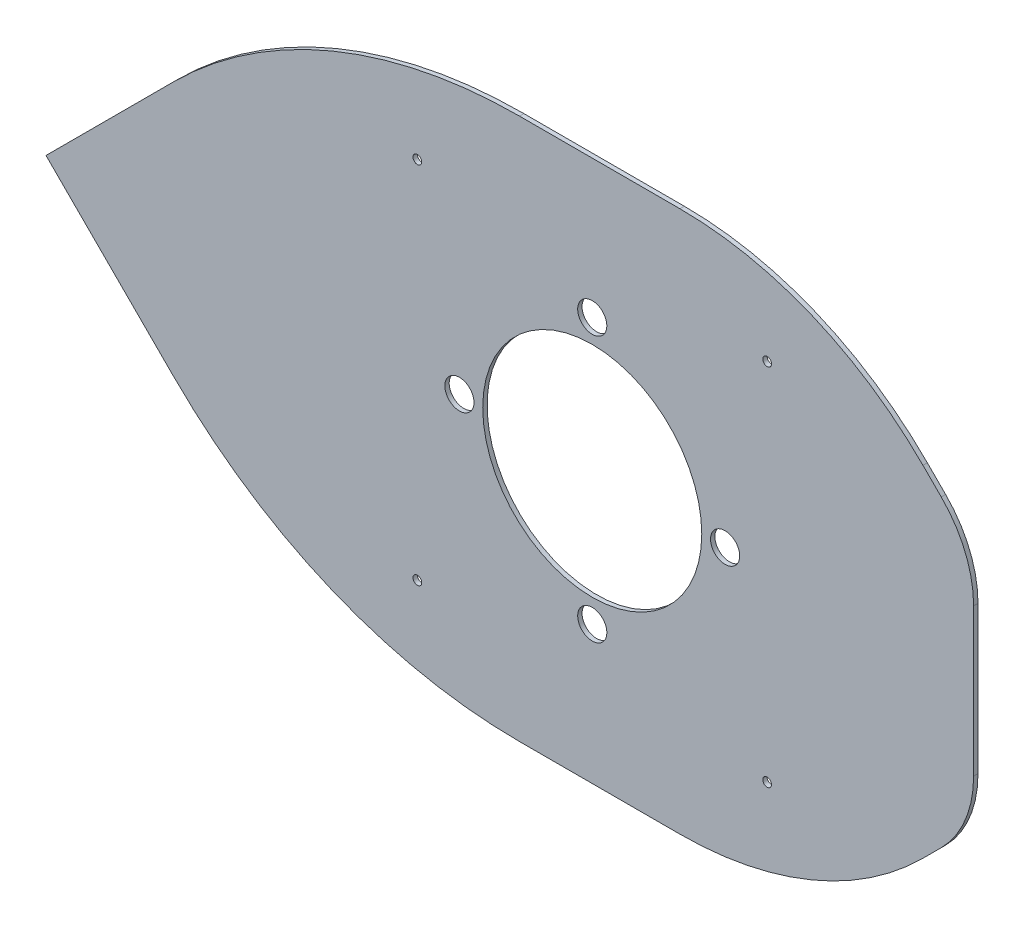
ISO-10303-21;
HEADER;
FILE_DESCRIPTION(('STEP AP214'),'2;1');
FILE_NAME('part.step','',(''),(''),'','','');
FILE_SCHEMA(('AUTOMOTIVE_DESIGN { 1 0 10303 214 1 1 1 1 }'));
ENDSEC;
DATA;
#1=APPLICATION_CONTEXT('core data for automotive mechanical design processes');
#2=APPLICATION_PROTOCOL_DEFINITION('international standard','automotive_design',2000,#1);
#3=PRODUCT_CONTEXT('',#1,'mechanical');
#4=PRODUCT('Part','Part','',(#3));
#5=PRODUCT_RELATED_PRODUCT_CATEGORY('part','',(#4));
#6=PRODUCT_DEFINITION_FORMATION('','',#4);
#7=PRODUCT_DEFINITION_CONTEXT('part definition',#1,'design');
#8=PRODUCT_DEFINITION('design','',#6,#7);
#9=PRODUCT_DEFINITION_SHAPE('','',#8);
#10=(LENGTH_UNIT() NAMED_UNIT(*) SI_UNIT(.MILLI.,.METRE.));
#11=(NAMED_UNIT(*) PLANE_ANGLE_UNIT() SI_UNIT($,.RADIAN.));
#12=(NAMED_UNIT(*) SI_UNIT($,.STERADIAN.) SOLID_ANGLE_UNIT());
#13=UNCERTAINTY_MEASURE_WITH_UNIT(LENGTH_MEASURE(1.E-05),#10,'distance_accuracy_value','');
#14=(GEOMETRIC_REPRESENTATION_CONTEXT(3) GLOBAL_UNCERTAINTY_ASSIGNED_CONTEXT((#13)) GLOBAL_UNIT_ASSIGNED_CONTEXT((#10,
#11,#12)) REPRESENTATION_CONTEXT('',''));
#15=CARTESIAN_POINT('',(0.,0.,0.));
#16=DIRECTION('',(0.,0.,1.));
#17=DIRECTION('',(1.,0.,0.));
#18=AXIS2_PLACEMENT_3D('',#15,#16,#17);
#19=CARTESIAN_POINT('',(221.248555261021,58.3805896169851,-1.5));
#20=DIRECTION('',(-0.707106781186555,-0.70710678118654,0.));
#21=DIRECTION('',(0.70710678118654,-0.707106781186555,0.));
#22=AXIS2_PLACEMENT_3D('',#19,#20,#21);
#23=PLANE('',#22);
#24=DIRECTION('',(0.,0.,1.));
#25=VECTOR('',#24,1.);
#26=CARTESIAN_POINT('',(221.248555261021,58.3805896169851,-1.5));
#27=LINE('',#26,#25);
#28=CARTESIAN_POINT('',(221.248555261021,58.3805896169851,-28.));
#29=VERTEX_POINT('',#28);
#30=CARTESIAN_POINT('',(221.248555261021,58.3805896169851,-26.5));
#31=VERTEX_POINT('',#30);
#32=EDGE_CURVE('E158',#29,#31,#27,.T.);
#33=ORIENTED_EDGE('',*,*,#32,.T.);
#34=DIRECTION('',(-0.707106781186541,0.707106781186554,0.));
#35=VECTOR('',#34,1.);
#36=CARTESIAN_POINT('',(227.522725240716,52.1064196372901,-26.5));
#37=LINE('',#36,#35);
#38=CARTESIAN_POINT('',(227.522725240716,52.1064196372901,-26.5));
#39=VERTEX_POINT('',#38);
#40=EDGE_CURVE('E146',#39,#31,#37,.T.);
#41=ORIENTED_EDGE('',*,*,#40,.F.);
#42=DIRECTION('',(0.,0.,1.));
#43=VECTOR('',#42,1.);
#44=CARTESIAN_POINT('',(227.522725240716,52.1064196372901,-1.5));
#45=LINE('',#44,#43);
#46=CARTESIAN_POINT('',(227.522725240716,52.1064196372901,-28.));
#47=VERTEX_POINT('',#46);
#48=EDGE_CURVE('E75',#47,#39,#45,.T.);
#49=ORIENTED_EDGE('',*,*,#48,.F.);
#50=DIRECTION('',(0.707106781186542,-0.707106781186553,0.));
#51=VECTOR('',#50,1.);
#52=CARTESIAN_POINT('',(221.248555261021,58.3805896169851,-28.));
#53=LINE('',#52,#51);
#54=EDGE_CURVE('E163',#29,#47,#53,.T.);
#55=ORIENTED_EDGE('',*,*,#54,.F.);
#56=EDGE_LOOP('',(#33,#41,#49,#55));
#57=FACE_BOUND('',#56,.T.);
#58=ADVANCED_FACE('F52',(#57),#23,.F.);
#59=CARTESIAN_POINT('',(137.867965644035,-25.,-1.5));
#60=DIRECTION('',(0.,0.,1.));
#61=DIRECTION('',(1.,0.,0.));
#62=AXIS2_PLACEMENT_3D('',#59,#60,#61);
#63=CYLINDRICAL_SURFACE('',#62,117.917960675006);
#64=DIRECTION('',(0.,0.,1.));
#65=VECTOR('',#64,1.);
#66=CARTESIAN_POINT('',(137.867965644035,92.9179606750063,-1.5));
#67=LINE('',#66,#65);
#68=CARTESIAN_POINT('',(137.867965644035,92.9179606750063,-28.));
#69=VERTEX_POINT('',#68);
#70=CARTESIAN_POINT('',(137.867965644035,92.9179606750063,-26.5));
#71=VERTEX_POINT('',#70);
#72=EDGE_CURVE('E160',#69,#71,#67,.T.);
#73=ORIENTED_EDGE('',*,*,#72,.T.);
#74=CARTESIAN_POINT('',(137.867965644035,-25.,-26.5));
#75=DIRECTION('',(0.,0.,-1.));
#76=DIRECTION('',(-1.,0.,0.));
#77=AXIS2_PLACEMENT_3D('',#74,#75,#76);
#78=CIRCLE('',#77,117.917960675006);
#79=EDGE_CURVE('E149',#31,#71,#78,.F.);
#80=ORIENTED_EDGE('',*,*,#79,.F.);
#81=ORIENTED_EDGE('',*,*,#32,.F.);
#82=CARTESIAN_POINT('',(137.867965644035,-25.,-28.));
#83=DIRECTION('',(0.,0.,-1.));
#84=DIRECTION('',(-1.,0.,0.));
#85=AXIS2_PLACEMENT_3D('',#82,#83,#84);
#86=CIRCLE('',#85,117.917960675006);
#87=EDGE_CURVE('E294',#69,#29,#86,.T.);
#88=ORIENTED_EDGE('',*,*,#87,.F.);
#89=EDGE_LOOP('',(#73,#80,#81,#88));
#90=FACE_BOUND('',#89,.T.);
#91=ADVANCED_FACE('F156',(#90),#63,.T.);
#92=CARTESIAN_POINT('',(82.8427124746184,92.9179606750063,-1.5));
#93=DIRECTION('',(0.,-1.,0.));
#94=DIRECTION('',(1.,0.,0.));
#95=AXIS2_PLACEMENT_3D('',#92,#93,#94);
#96=PLANE('',#95);
#97=DIRECTION('',(0.,0.,1.));
#98=VECTOR('',#97,1.);
#99=CARTESIAN_POINT('',(82.8427124746184,92.9179606750063,-1.5));
#100=LINE('',#99,#98);
#101=CARTESIAN_POINT('',(82.8427124746185,92.9179606750063,-28.));
#102=VERTEX_POINT('',#101);
#103=CARTESIAN_POINT('',(82.8427124746184,92.9179606750063,-26.5));
#104=VERTEX_POINT('',#103);
#105=EDGE_CURVE('E165',#102,#104,#100,.T.);
#106=ORIENTED_EDGE('',*,*,#105,.T.);
#107=DIRECTION('',(-1.,0.,0.));
#108=VECTOR('',#107,1.);
#109=CARTESIAN_POINT('',(137.867965644035,92.9179606750063,-26.5));
#110=LINE('',#109,#108);
#111=EDGE_CURVE('E161',#71,#104,#110,.T.);
#112=ORIENTED_EDGE('',*,*,#111,.F.);
#113=ORIENTED_EDGE('',*,*,#72,.F.);
#114=DIRECTION('',(1.,0.,0.));
#115=VECTOR('',#114,1.);
#116=CARTESIAN_POINT('',(82.8427124746185,92.9179606750063,-28.));
#117=LINE('',#116,#115);
#118=EDGE_CURVE('E291',#102,#69,#117,.T.);
#119=ORIENTED_EDGE('',*,*,#118,.F.);
#120=EDGE_LOOP('',(#106,#112,#113,#119));
#121=FACE_BOUND('',#120,.T.);
#122=ADVANCED_FACE('F344',(#121),#96,.F.);
#123=CARTESIAN_POINT('',(82.8427124746184,-75.0000000000001,-1.5));
#124=DIRECTION('',(0.,0.,1.));
#125=DIRECTION('',(1.,0.,0.));
#126=AXIS2_PLACEMENT_3D('',#123,#124,#125);
#127=CYLINDRICAL_SURFACE('',#126,167.917960675006);
#128=DIRECTION('',(0.,0.,1.));
#129=VECTOR('',#128,1.);
#130=CARTESIAN_POINT('',(-35.893216201694,43.7359286763136,-1.5));
#131=LINE('',#130,#129);
#132=CARTESIAN_POINT('',(-35.893216201694,43.7359286763136,-28.));
#133=VERTEX_POINT('',#132);
#134=CARTESIAN_POINT('',(-35.893216201694,43.7359286763136,-26.5));
#135=VERTEX_POINT('',#134);
#136=EDGE_CURVE('E172',#133,#135,#131,.T.);
#137=ORIENTED_EDGE('',*,*,#136,.T.);
#138=CARTESIAN_POINT('',(82.8427124746184,-75.0000000000001,-26.5));
#139=DIRECTION('',(0.,0.,-1.));
#140=DIRECTION('',(-1.,0.,0.));
#141=AXIS2_PLACEMENT_3D('',#138,#139,#140);
#142=CIRCLE('',#141,167.917960675006);
#143=EDGE_CURVE('E341',#104,#135,#142,.F.);
#144=ORIENTED_EDGE('',*,*,#143,.F.);
#145=ORIENTED_EDGE('',*,*,#105,.F.);
#146=CARTESIAN_POINT('',(82.8427124746184,-75.0000000000001,-28.));
#147=DIRECTION('',(0.,0.,-1.));
#148=DIRECTION('',(-1.,0.,0.));
#149=AXIS2_PLACEMENT_3D('',#146,#147,#148);
#150=CIRCLE('',#149,167.917960675006);
#151=EDGE_CURVE('E288',#133,#102,#150,.T.);
#152=ORIENTED_EDGE('',*,*,#151,.F.);
#153=EDGE_LOOP('',(#137,#144,#145,#152));
#154=FACE_BOUND('',#153,.T.);
#155=ADVANCED_FACE('F340',(#154),#127,.T.);
#156=CARTESIAN_POINT('',(-79.629144878008,0.,-1.5));
#157=DIRECTION('',(0.707106781186545,-0.70710678118655,0.));
#158=DIRECTION('',(0.70710678118655,0.707106781186545,0.));
#159=AXIS2_PLACEMENT_3D('',#156,#157,#158);
#160=PLANE('',#159);
#161=DIRECTION('',(0.,0.,1.));
#162=VECTOR('',#161,1.);
#163=CARTESIAN_POINT('',(-79.629144878008,0.,-1.5));
#164=LINE('',#163,#162);
#165=CARTESIAN_POINT('',(-79.629144878008,0.,-28.));
#166=VERTEX_POINT('',#165);
#167=CARTESIAN_POINT('',(-79.629144878008,0.,-26.5));
#168=VERTEX_POINT('',#167);
#169=EDGE_CURVE('E175',#166,#168,#164,.T.);
#170=ORIENTED_EDGE('',*,*,#169,.T.);
#171=DIRECTION('',(-0.70710678118655,-0.707106781186545,0.));
#172=VECTOR('',#171,1.);
#173=CARTESIAN_POINT('',(-35.893216201694,43.7359286763136,-26.5));
#174=LINE('',#173,#172);
#175=EDGE_CURVE('E337',#135,#168,#174,.T.);
#176=ORIENTED_EDGE('',*,*,#175,.F.);
#177=ORIENTED_EDGE('',*,*,#136,.F.);
#178=DIRECTION('',(0.70710678118655,0.707106781186545,0.));
#179=VECTOR('',#178,1.);
#180=CARTESIAN_POINT('',(-79.629144878008,0.,-28.));
#181=LINE('',#180,#179);
#182=EDGE_CURVE('E285',#166,#133,#181,.T.);
#183=ORIENTED_EDGE('',*,*,#182,.F.);
#184=EDGE_LOOP('',(#170,#176,#177,#183));
#185=FACE_BOUND('',#184,.T.);
#186=ADVANCED_FACE('F335',(#185),#160,.F.);
#187=CARTESIAN_POINT('',(-35.893216201694,-43.7359286763137,-1.5));
#188=DIRECTION('',(0.707106781186544,0.70710678118655,0.));
#189=DIRECTION('',(-0.70710678118655,0.707106781186545,0.));
#190=AXIS2_PLACEMENT_3D('',#187,#188,#189);
#191=PLANE('',#190);
#192=DIRECTION('',(0.,0.,1.));
#193=VECTOR('',#192,1.);
#194=CARTESIAN_POINT('',(-35.893216201694,-43.7359286763137,-1.5));
#195=LINE('',#194,#193);
#196=CARTESIAN_POINT('',(-35.8932162016939,-43.7359286763137,-28.));
#197=VERTEX_POINT('',#196);
#198=CARTESIAN_POINT('',(-35.893216201694,-43.7359286763136,-26.5));
#199=VERTEX_POINT('',#198);
#200=EDGE_CURVE('E178',#197,#199,#195,.T.);
#201=ORIENTED_EDGE('',*,*,#200,.T.);
#202=DIRECTION('',(0.707106781186551,-0.707106781186545,0.));
#203=VECTOR('',#202,1.);
#204=CARTESIAN_POINT('',(-79.629144878008,0.,-26.5));
#205=LINE('',#204,#203);
#206=EDGE_CURVE('E331',#168,#199,#205,.T.);
#207=ORIENTED_EDGE('',*,*,#206,.F.);
#208=ORIENTED_EDGE('',*,*,#169,.F.);
#209=DIRECTION('',(-0.70710678118655,0.707106781186545,0.));
#210=VECTOR('',#209,1.);
#211=CARTESIAN_POINT('',(-35.8932162016939,-43.7359286763137,-28.));
#212=LINE('',#211,#210);
#213=EDGE_CURVE('E282',#197,#166,#212,.T.);
#214=ORIENTED_EDGE('',*,*,#213,.F.);
#215=EDGE_LOOP('',(#201,#207,#208,#214));
#216=FACE_BOUND('',#215,.T.);
#217=ADVANCED_FACE('F330',(#216),#191,.F.);
#218=CARTESIAN_POINT('',(82.8427124746184,75.0000000000001,-1.5));
#219=DIRECTION('',(0.,0.,1.));
#220=DIRECTION('',(1.,0.,0.));
#221=AXIS2_PLACEMENT_3D('',#218,#219,#220);
#222=CYLINDRICAL_SURFACE('',#221,167.917960675006);
#223=DIRECTION('',(0.,0.,1.));
#224=VECTOR('',#223,1.);
#225=CARTESIAN_POINT('',(82.8427124746184,-92.9179606750063,-1.5));
#226=LINE('',#225,#224);
#227=CARTESIAN_POINT('',(82.8427124746184,-92.9179606750063,-28.));
#228=VERTEX_POINT('',#227);
#229=CARTESIAN_POINT('',(82.8427124746183,-92.9179606750063,-26.5));
#230=VERTEX_POINT('',#229);
#231=EDGE_CURVE('E181',#228,#230,#226,.T.);
#232=ORIENTED_EDGE('',*,*,#231,.T.);
#233=CARTESIAN_POINT('',(82.8427124746184,75.0000000000001,-26.5));
#234=DIRECTION('',(0.,0.,-1.));
#235=DIRECTION('',(-1.,0.,0.));
#236=AXIS2_PLACEMENT_3D('',#233,#234,#235);
#237=CIRCLE('',#236,167.917960675006);
#238=EDGE_CURVE('E327',#199,#230,#237,.F.);
#239=ORIENTED_EDGE('',*,*,#238,.F.);
#240=ORIENTED_EDGE('',*,*,#200,.F.);
#241=CARTESIAN_POINT('',(82.8427124746184,75.0000000000001,-28.));
#242=DIRECTION('',(0.,0.,-1.));
#243=DIRECTION('',(-1.,0.,0.));
#244=AXIS2_PLACEMENT_3D('',#241,#242,#243);
#245=CIRCLE('',#244,167.917960675006);
#246=EDGE_CURVE('E279',#228,#197,#245,.T.);
#247=ORIENTED_EDGE('',*,*,#246,.F.);
#248=EDGE_LOOP('',(#232,#239,#240,#247));
#249=FACE_BOUND('',#248,.T.);
#250=ADVANCED_FACE('F325',(#249),#222,.T.);
#251=CARTESIAN_POINT('',(137.867965644035,-92.9179606750063,-1.5));
#252=DIRECTION('',(0.,1.,0.));
#253=DIRECTION('',(-1.,0.,0.));
#254=AXIS2_PLACEMENT_3D('',#251,#252,#253);
#255=PLANE('',#254);
#256=DIRECTION('',(0.,0.,1.));
#257=VECTOR('',#256,1.);
#258=CARTESIAN_POINT('',(137.867965644035,-92.9179606750063,-1.5));
#259=LINE('',#258,#257);
#260=CARTESIAN_POINT('',(137.867965644035,-92.9179606750063,-28.));
#261=VERTEX_POINT('',#260);
#262=CARTESIAN_POINT('',(137.867965644035,-92.9179606750063,-26.5));
#263=VERTEX_POINT('',#262);
#264=EDGE_CURVE('E184',#261,#263,#259,.T.);
#265=ORIENTED_EDGE('',*,*,#264,.T.);
#266=DIRECTION('',(1.,0.,0.));
#267=VECTOR('',#266,1.);
#268=CARTESIAN_POINT('',(82.8427124746183,-92.9179606750063,-26.5));
#269=LINE('',#268,#267);
#270=EDGE_CURVE('E321',#230,#263,#269,.T.);
#271=ORIENTED_EDGE('',*,*,#270,.F.);
#272=ORIENTED_EDGE('',*,*,#231,.F.);
#273=DIRECTION('',(-1.,0.,0.));
#274=VECTOR('',#273,1.);
#275=CARTESIAN_POINT('',(137.867965644035,-92.9179606750063,-28.));
#276=LINE('',#275,#274);
#277=EDGE_CURVE('E276',#261,#228,#276,.T.);
#278=ORIENTED_EDGE('',*,*,#277,.F.);
#279=EDGE_LOOP('',(#265,#271,#272,#278));
#280=FACE_BOUND('',#279,.T.);
#281=ADVANCED_FACE('F320',(#280),#255,.F.);
#282=CARTESIAN_POINT('',(137.867965644035,25.,-1.5));
#283=DIRECTION('',(0.,0.,1.));
#284=DIRECTION('',(1.,0.,0.));
#285=AXIS2_PLACEMENT_3D('',#282,#283,#284);
#286=CYLINDRICAL_SURFACE('',#285,117.917960675006);
#287=DIRECTION('',(0.,0.,1.));
#288=VECTOR('',#287,1.);
#289=CARTESIAN_POINT('',(221.248555261021,-58.380589616985,-1.5));
#290=LINE('',#289,#288);
#291=CARTESIAN_POINT('',(221.248555261021,-58.3805896169849,-28.));
#292=VERTEX_POINT('',#291);
#293=CARTESIAN_POINT('',(221.248555261021,-58.380589616985,-26.5));
#294=VERTEX_POINT('',#293);
#295=EDGE_CURVE('E187',#292,#294,#290,.T.);
#296=ORIENTED_EDGE('',*,*,#295,.T.);
#297=CARTESIAN_POINT('',(137.867965644035,25.,-26.5));
#298=DIRECTION('',(0.,0.,-1.));
#299=DIRECTION('',(-1.,0.,0.));
#300=AXIS2_PLACEMENT_3D('',#297,#298,#299);
#301=CIRCLE('',#300,117.917960675006);
#302=EDGE_CURVE('E317',#263,#294,#301,.F.);
#303=ORIENTED_EDGE('',*,*,#302,.F.);
#304=ORIENTED_EDGE('',*,*,#264,.F.);
#305=CARTESIAN_POINT('',(137.867965644035,25.,-28.));
#306=DIRECTION('',(0.,0.,-1.));
#307=DIRECTION('',(-1.,0.,0.));
#308=AXIS2_PLACEMENT_3D('',#305,#306,#307);
#309=CIRCLE('',#308,117.917960675006);
#310=EDGE_CURVE('E273',#292,#261,#309,.T.);
#311=ORIENTED_EDGE('',*,*,#310,.F.);
#312=EDGE_LOOP('',(#296,#303,#304,#311));
#313=FACE_BOUND('',#312,.T.);
#314=ADVANCED_FACE('F315',(#313),#286,.T.);
#315=CARTESIAN_POINT('',(227.522725240716,-52.1064196372901,-1.5));
#316=DIRECTION('',(-0.707106781186553,0.707106781186542,0.));
#317=DIRECTION('',(-0.707106781186542,-0.707106781186553,0.));
#318=AXIS2_PLACEMENT_3D('',#315,#316,#317);
#319=PLANE('',#318);
#320=DIRECTION('',(0.,0.,1.));
#321=VECTOR('',#320,1.);
#322=CARTESIAN_POINT('',(227.522725240716,-52.1064196372901,-1.5));
#323=LINE('',#322,#321);
#324=CARTESIAN_POINT('',(227.522725240716,-52.1064196372901,-28.));
#325=VERTEX_POINT('',#324);
#326=CARTESIAN_POINT('',(227.522725240716,-52.1064196372901,-26.5));
#327=VERTEX_POINT('',#326);
#328=EDGE_CURVE('E190',#325,#327,#323,.T.);
#329=ORIENTED_EDGE('',*,*,#328,.T.);
#330=DIRECTION('',(0.707106781186543,0.707106781186552,0.));
#331=VECTOR('',#330,1.);
#332=CARTESIAN_POINT('',(221.248555261021,-58.380589616985,-26.5));
#333=LINE('',#332,#331);
#334=EDGE_CURVE('E311',#294,#327,#333,.T.);
#335=ORIENTED_EDGE('',*,*,#334,.F.);
#336=ORIENTED_EDGE('',*,*,#295,.F.);
#337=DIRECTION('',(-0.707106781186542,-0.707106781186553,0.));
#338=VECTOR('',#337,1.);
#339=CARTESIAN_POINT('',(227.522725240716,-52.1064196372901,-28.));
#340=LINE('',#339,#338);
#341=EDGE_CURVE('E270',#325,#292,#340,.T.);
#342=ORIENTED_EDGE('',*,*,#341,.F.);
#343=EDGE_LOOP('',(#329,#335,#336,#342));
#344=FACE_BOUND('',#343,.T.);
#345=ADVANCED_FACE('F310',(#344),#319,.F.);
#346=CARTESIAN_POINT('',(200.710678118654,-25.2943725152283,-1.5));
#347=DIRECTION('',(0.,0.,1.));
#348=DIRECTION('',(1.,0.,0.));
#349=AXIS2_PLACEMENT_3D('',#346,#347,#348);
#350=CYLINDRICAL_SURFACE('',#349,37.9179606750063);
#351=DIRECTION('',(0.,0.,1.));
#352=VECTOR('',#351,1.);
#353=CARTESIAN_POINT('',(238.628638793661,-25.2943725152283,-1.5));
#354=LINE('',#353,#352);
#355=CARTESIAN_POINT('',(238.628638793661,-25.2943725152283,-28.));
#356=VERTEX_POINT('',#355);
#357=CARTESIAN_POINT('',(238.628638793661,-25.2943725152283,-26.5));
#358=VERTEX_POINT('',#357);
#359=EDGE_CURVE('E193',#356,#358,#354,.T.);
#360=ORIENTED_EDGE('',*,*,#359,.T.);
#361=CARTESIAN_POINT('',(200.710678118654,-25.2943725152283,-26.5));
#362=DIRECTION('',(0.,0.,-1.));
#363=DIRECTION('',(-1.,0.,0.));
#364=AXIS2_PLACEMENT_3D('',#361,#362,#363);
#365=CIRCLE('',#364,37.9179606750063);
#366=EDGE_CURVE('E307',#327,#358,#365,.F.);
#367=ORIENTED_EDGE('',*,*,#366,.F.);
#368=ORIENTED_EDGE('',*,*,#328,.F.);
#369=CARTESIAN_POINT('',(200.710678118654,-25.2943725152283,-28.));
#370=DIRECTION('',(0.,0.,-1.));
#371=DIRECTION('',(-1.,0.,0.));
#372=AXIS2_PLACEMENT_3D('',#369,#370,#371);
#373=CIRCLE('',#372,37.9179606750063);
#374=EDGE_CURVE('E267',#356,#325,#373,.T.);
#375=ORIENTED_EDGE('',*,*,#374,.F.);
#376=EDGE_LOOP('',(#360,#367,#368,#375));
#377=FACE_BOUND('',#376,.T.);
#378=ADVANCED_FACE('F305',(#377),#350,.T.);
#379=CARTESIAN_POINT('',(238.628638793661,25.2943725152283,-1.5));
#380=DIRECTION('',(-1.,0.,0.));
#381=DIRECTION('',(0.,0.,1.));
#382=AXIS2_PLACEMENT_3D('',#379,#380,#381);
#383=PLANE('',#382);
#384=DIRECTION('',(0.,0.,1.));
#385=VECTOR('',#384,1.);
#386=CARTESIAN_POINT('',(238.628638793661,25.2943725152283,-1.5));
#387=LINE('',#386,#385);
#388=CARTESIAN_POINT('',(238.628638793661,25.2943725152283,-28.));
#389=VERTEX_POINT('',#388);
#390=CARTESIAN_POINT('',(238.628638793661,25.2943725152283,-26.5));
#391=VERTEX_POINT('',#390);
#392=EDGE_CURVE('E196',#389,#391,#387,.T.);
#393=ORIENTED_EDGE('',*,*,#392,.T.);
#394=DIRECTION('',(0.,1.,0.));
#395=VECTOR('',#394,1.);
#396=CARTESIAN_POINT('',(238.628638793661,-25.2943725152283,-26.5));
#397=LINE('',#396,#395);
#398=EDGE_CURVE('E67',#358,#391,#397,.T.);
#399=ORIENTED_EDGE('',*,*,#398,.F.);
#400=ORIENTED_EDGE('',*,*,#359,.F.);
#401=DIRECTION('',(0.,-1.,0.));
#402=VECTOR('',#401,1.);
#403=CARTESIAN_POINT('',(238.628638793661,25.2943725152283,-28.));
#404=LINE('',#403,#402);
#405=EDGE_CURVE('E264',#389,#356,#404,.T.);
#406=ORIENTED_EDGE('',*,*,#405,.F.);
#407=EDGE_LOOP('',(#393,#399,#400,#406));
#408=FACE_BOUND('',#407,.T.);
#409=ADVANCED_FACE('F301',(#408),#383,.F.);
#410=CARTESIAN_POINT('',(200.710678118654,25.2943725152283,-1.5));
#411=DIRECTION('',(0.,0.,1.));
#412=DIRECTION('',(1.,0.,0.));
#413=AXIS2_PLACEMENT_3D('',#410,#411,#412);
#414=CYLINDRICAL_SURFACE('',#413,37.9179606750063);
#415=ORIENTED_EDGE('',*,*,#48,.T.);
#416=CARTESIAN_POINT('',(200.710678118654,25.2943725152283,-26.5));
#417=DIRECTION('',(0.,0.,-1.));
#418=DIRECTION('',(-1.,0.,0.));
#419=AXIS2_PLACEMENT_3D('',#416,#417,#418);
#420=CIRCLE('',#419,37.9179606750063);
#421=EDGE_CURVE('E151',#391,#39,#420,.F.);
#422=ORIENTED_EDGE('',*,*,#421,.F.);
#423=ORIENTED_EDGE('',*,*,#392,.F.);
#424=CARTESIAN_POINT('',(200.710678118654,25.2943725152283,-28.));
#425=DIRECTION('',(0.,0.,-1.));
#426=DIRECTION('',(-1.,0.,0.));
#427=AXIS2_PLACEMENT_3D('',#424,#425,#426);
#428=CIRCLE('',#427,37.9179606750063);
#429=EDGE_CURVE('E261',#47,#389,#428,.T.);
#430=ORIENTED_EDGE('',*,*,#429,.F.);
#431=EDGE_LOOP('',(#415,#422,#423,#430));
#432=FACE_BOUND('',#431,.T.);
#433=ADVANCED_FACE('F54',(#432),#414,.T.);
#434=CARTESIAN_POINT('',(200.710678118654,25.2943725152283,-26.5));
#435=DIRECTION('',(0.,0.,-1.));
#436=DIRECTION('',(-1.,0.,0.));
#437=AXIS2_PLACEMENT_3D('',#434,#435,#436);
#438=PLANE('',#437);
#439=CARTESIAN_POINT('',(107.783046880008,45.575,-26.5));
#440=DIRECTION('',(0.,0.,-1.));
#441=DIRECTION('',(-1.,0.,0.));
#442=AXIS2_PLACEMENT_3D('',#439,#440,#441);
#443=CIRCLE('',#442,5.00000000000001);
#444=CARTESIAN_POINT('',(102.783046880008,45.575,-26.5));
#445=VERTEX_POINT('',#444);
#446=EDGE_CURVE('E258',#445,#445,#443,.T.);
#447=ORIENTED_EDGE('',*,*,#446,.T.);
#448=EDGE_LOOP('',(#447));
#449=FACE_BOUND('',#448,.T.);
#450=CARTESIAN_POINT('',(107.783046880008,0.,-26.5));
#451=DIRECTION('',(0.,0.,-1.));
#452=DIRECTION('',(-1.,0.,0.));
#453=AXIS2_PLACEMENT_3D('',#450,#451,#452);
#454=CIRCLE('',#453,37.575);
#455=CARTESIAN_POINT('',(70.2080468800082,0.,-26.5));
#456=VERTEX_POINT('',#455);
#457=EDGE_CURVE('E255',#456,#456,#454,.T.);
#458=ORIENTED_EDGE('',*,*,#457,.T.);
#459=EDGE_LOOP('',(#458));
#460=FACE_BOUND('',#459,.T.);
#461=CARTESIAN_POINT('',(62.2080468800082,0.,-26.5));
#462=DIRECTION('',(0.,0.,-1.));
#463=DIRECTION('',(-1.,0.,0.));
#464=AXIS2_PLACEMENT_3D('',#461,#462,#463);
#465=CIRCLE('',#464,5.);
#466=CARTESIAN_POINT('',(57.2080468800082,0.,-26.5));
#467=VERTEX_POINT('',#466);
#468=EDGE_CURVE('E252',#467,#467,#465,.T.);
#469=ORIENTED_EDGE('',*,*,#468,.T.);
#470=EDGE_LOOP('',(#469));
#471=FACE_BOUND('',#470,.T.);
#472=CARTESIAN_POINT('',(107.783046880008,-45.575,-26.5));
#473=DIRECTION('',(0.,0.,-1.));
#474=DIRECTION('',(-1.,0.,0.));
#475=AXIS2_PLACEMENT_3D('',#472,#473,#474);
#476=CIRCLE('',#475,5.00000000000001);
#477=CARTESIAN_POINT('',(102.783046880008,-45.575,-26.5));
#478=VERTEX_POINT('',#477);
#479=EDGE_CURVE('E249',#478,#478,#476,.T.);
#480=ORIENTED_EDGE('',*,*,#479,.T.);
#481=EDGE_LOOP('',(#480));
#482=FACE_BOUND('',#481,.T.);
#483=CARTESIAN_POINT('',(153.358046880008,0.,-26.5));
#484=DIRECTION('',(0.,0.,-1.));
#485=DIRECTION('',(-1.,0.,0.));
#486=AXIS2_PLACEMENT_3D('',#483,#484,#485);
#487=CIRCLE('',#486,5.00000000000002);
#488=CARTESIAN_POINT('',(148.358046880008,0.,-26.5));
#489=VERTEX_POINT('',#488);
#490=EDGE_CURVE('E246',#489,#489,#487,.T.);
#491=ORIENTED_EDGE('',*,*,#490,.T.);
#492=EDGE_LOOP('',(#491));
#493=FACE_BOUND('',#492,.T.);
#494=CARTESIAN_POINT('',(167.783046880007,-62.5,-26.5));
#495=DIRECTION('',(0.,0.,-1.));
#496=DIRECTION('',(-1.,0.,0.));
#497=AXIS2_PLACEMENT_3D('',#494,#495,#496);
#498=CIRCLE('',#497,1.5);
#499=CARTESIAN_POINT('',(166.283046880007,-62.5,-26.5));
#500=VERTEX_POINT('',#499);
#501=EDGE_CURVE('E199',#500,#500,#498,.T.);
#502=ORIENTED_EDGE('',*,*,#501,.T.);
#503=EDGE_LOOP('',(#502));
#504=FACE_BOUND('',#503,.T.);
#505=CARTESIAN_POINT('',(47.7830468800069,-62.5,-26.5));
#506=DIRECTION('',(0.,0.,-1.));
#507=DIRECTION('',(-1.,0.,0.));
#508=AXIS2_PLACEMENT_3D('',#505,#506,#507);
#509=CIRCLE('',#508,1.5);
#510=CARTESIAN_POINT('',(46.2830468800069,-62.5,-26.5));
#511=VERTEX_POINT('',#510);
#512=EDGE_CURVE('E202',#511,#511,#509,.T.);
#513=ORIENTED_EDGE('',*,*,#512,.T.);
#514=EDGE_LOOP('',(#513));
#515=FACE_BOUND('',#514,.T.);
#516=CARTESIAN_POINT('',(47.7830468800082,62.5,-26.5));
#517=DIRECTION('',(0.,0.,-1.));
#518=DIRECTION('',(-1.,0.,0.));
#519=AXIS2_PLACEMENT_3D('',#516,#517,#518);
#520=CIRCLE('',#519,1.5);
#521=CARTESIAN_POINT('',(46.2830468800082,62.5,-26.5));
#522=VERTEX_POINT('',#521);
#523=EDGE_CURVE('E60',#522,#522,#520,.T.);
#524=ORIENTED_EDGE('',*,*,#523,.T.);
#525=EDGE_LOOP('',(#524));
#526=FACE_BOUND('',#525,.T.);
#527=CARTESIAN_POINT('',(167.783046880008,62.5,-26.5));
#528=DIRECTION('',(0.,0.,-1.));
#529=DIRECTION('',(-1.,0.,0.));
#530=AXIS2_PLACEMENT_3D('',#527,#528,#529);
#531=CIRCLE('',#530,1.5);
#532=CARTESIAN_POINT('',(166.283046880008,62.5,-26.5));
#533=VERTEX_POINT('',#532);
#534=EDGE_CURVE('E12',#533,#533,#531,.T.);
#535=ORIENTED_EDGE('',*,*,#534,.T.);
#536=EDGE_LOOP('',(#535));
#537=FACE_BOUND('',#536,.T.);
#538=ORIENTED_EDGE('',*,*,#421,.T.);
#539=ORIENTED_EDGE('',*,*,#40,.T.);
#540=ORIENTED_EDGE('',*,*,#79,.T.);
#541=ORIENTED_EDGE('',*,*,#111,.T.);
#542=ORIENTED_EDGE('',*,*,#143,.T.);
#543=ORIENTED_EDGE('',*,*,#175,.T.);
#544=ORIENTED_EDGE('',*,*,#206,.T.);
#545=ORIENTED_EDGE('',*,*,#238,.T.);
#546=ORIENTED_EDGE('',*,*,#270,.T.);
#547=ORIENTED_EDGE('',*,*,#302,.T.);
#548=ORIENTED_EDGE('',*,*,#334,.T.);
#549=ORIENTED_EDGE('',*,*,#366,.T.);
#550=ORIENTED_EDGE('',*,*,#398,.T.);
#551=EDGE_LOOP('',(#538,#539,#540,#541,#542,#543,#544,#545,#546,#547,#548,#549,#550));
#552=FACE_BOUND('',#551,.T.);
#553=ADVANCED_FACE('F148',(#449,#460,#471,#482,#493,#504,#515,#526,#537,#552),#438,.F.);
#554=CARTESIAN_POINT('',(200.710678118654,25.2943725152283,-28.));
#555=DIRECTION('',(0.,0.,-1.));
#556=DIRECTION('',(-1.,0.,0.));
#557=AXIS2_PLACEMENT_3D('',#554,#555,#556);
#558=PLANE('',#557);
#559=CARTESIAN_POINT('',(167.783046880007,-62.5,-28.));
#560=DIRECTION('',(0.,0.,-1.));
#561=DIRECTION('',(-1.,0.,0.));
#562=AXIS2_PLACEMENT_3D('',#559,#560,#561);
#563=CIRCLE('',#562,1.5);
#564=CARTESIAN_POINT('',(166.283046880007,-62.5,-28.));
#565=VERTEX_POINT('',#564);
#566=EDGE_CURVE('E226',#565,#565,#563,.T.);
#567=ORIENTED_EDGE('',*,*,#566,.F.);
#568=EDGE_LOOP('',(#567));
#569=FACE_BOUND('',#568,.T.);
#570=CARTESIAN_POINT('',(47.7830468800069,-62.5,-28.));
#571=DIRECTION('',(0.,0.,-1.));
#572=DIRECTION('',(-1.,0.,0.));
#573=AXIS2_PLACEMENT_3D('',#570,#571,#572);
#574=CIRCLE('',#573,1.5);
#575=CARTESIAN_POINT('',(46.2830468800069,-62.5,-28.));
#576=VERTEX_POINT('',#575);
#577=EDGE_CURVE('E220',#576,#576,#574,.T.);
#578=ORIENTED_EDGE('',*,*,#577,.F.);
#579=EDGE_LOOP('',(#578));
#580=FACE_BOUND('',#579,.T.);
#581=CARTESIAN_POINT('',(47.7830468800082,62.5,-28.));
#582=DIRECTION('',(0.,0.,-1.));
#583=DIRECTION('',(-1.,0.,0.));
#584=AXIS2_PLACEMENT_3D('',#581,#582,#583);
#585=CIRCLE('',#584,1.5);
#586=CARTESIAN_POINT('',(46.2830468800082,62.5,-28.));
#587=VERTEX_POINT('',#586);
#588=EDGE_CURVE('E217',#587,#587,#585,.T.);
#589=ORIENTED_EDGE('',*,*,#588,.F.);
#590=EDGE_LOOP('',(#589));
#591=FACE_BOUND('',#590,.T.);
#592=CARTESIAN_POINT('',(167.783046880008,62.5,-28.));
#593=DIRECTION('',(0.,0.,-1.));
#594=DIRECTION('',(-1.,0.,0.));
#595=AXIS2_PLACEMENT_3D('',#592,#593,#594);
#596=CIRCLE('',#595,1.5);
#597=CARTESIAN_POINT('',(166.283046880008,62.5,-28.));
#598=VERTEX_POINT('',#597);
#599=EDGE_CURVE('E219',#598,#598,#596,.T.);
#600=ORIENTED_EDGE('',*,*,#599,.F.);
#601=EDGE_LOOP('',(#600));
#602=FACE_BOUND('',#601,.T.);
#603=CARTESIAN_POINT('',(107.783046880008,45.575,-28.));
#604=DIRECTION('',(0.,0.,1.));
#605=DIRECTION('',(1.,0.,0.));
#606=AXIS2_PLACEMENT_3D('',#603,#604,#605);
#607=CIRCLE('',#606,5.00000000000001);
#608=CARTESIAN_POINT('',(112.783046880008,45.575,-28.));
#609=VERTEX_POINT('',#608);
#610=EDGE_CURVE('E223',#609,#609,#607,.T.);
#611=ORIENTED_EDGE('',*,*,#610,.T.);
#612=EDGE_LOOP('',(#611));
#613=FACE_BOUND('',#612,.T.);
#614=CARTESIAN_POINT('',(107.783046880008,0.,-28.));
#615=DIRECTION('',(0.,0.,1.));
#616=DIRECTION('',(1.,0.,0.));
#617=AXIS2_PLACEMENT_3D('',#614,#615,#616);
#618=CIRCLE('',#617,37.575);
#619=CARTESIAN_POINT('',(145.358046880008,0.,-28.));
#620=VERTEX_POINT('',#619);
#621=EDGE_CURVE('E232',#620,#620,#618,.T.);
#622=ORIENTED_EDGE('',*,*,#621,.T.);
#623=EDGE_LOOP('',(#622));
#624=FACE_BOUND('',#623,.T.);
#625=CARTESIAN_POINT('',(62.2080468800082,0.,-28.));
#626=DIRECTION('',(0.,0.,1.));
#627=DIRECTION('',(1.,0.,0.));
#628=AXIS2_PLACEMENT_3D('',#625,#626,#627);
#629=CIRCLE('',#628,5.);
#630=CARTESIAN_POINT('',(67.2080468800082,0.,-28.));
#631=VERTEX_POINT('',#630);
#632=EDGE_CURVE('E235',#631,#631,#629,.T.);
#633=ORIENTED_EDGE('',*,*,#632,.T.);
#634=EDGE_LOOP('',(#633));
#635=FACE_BOUND('',#634,.T.);
#636=CARTESIAN_POINT('',(107.783046880008,-45.575,-28.));
#637=DIRECTION('',(0.,0.,1.));
#638=DIRECTION('',(1.,0.,0.));
#639=AXIS2_PLACEMENT_3D('',#636,#637,#638);
#640=CIRCLE('',#639,5.00000000000001);
#641=CARTESIAN_POINT('',(112.783046880008,-45.575,-28.));
#642=VERTEX_POINT('',#641);
#643=EDGE_CURVE('E238',#642,#642,#640,.T.);
#644=ORIENTED_EDGE('',*,*,#643,.T.);
#645=EDGE_LOOP('',(#644));
#646=FACE_BOUND('',#645,.T.);
#647=CARTESIAN_POINT('',(153.358046880008,0.,-28.));
#648=DIRECTION('',(0.,0.,1.));
#649=DIRECTION('',(1.,0.,0.));
#650=AXIS2_PLACEMENT_3D('',#647,#648,#649);
#651=CIRCLE('',#650,5.00000000000002);
#652=CARTESIAN_POINT('',(158.358046880008,0.,-28.));
#653=VERTEX_POINT('',#652);
#654=EDGE_CURVE('E241',#653,#653,#651,.T.);
#655=ORIENTED_EDGE('',*,*,#654,.T.);
#656=EDGE_LOOP('',(#655));
#657=FACE_BOUND('',#656,.T.);
#658=ORIENTED_EDGE('',*,*,#429,.T.);
#659=ORIENTED_EDGE('',*,*,#405,.T.);
#660=ORIENTED_EDGE('',*,*,#374,.T.);
#661=ORIENTED_EDGE('',*,*,#341,.T.);
#662=ORIENTED_EDGE('',*,*,#310,.T.);
#663=ORIENTED_EDGE('',*,*,#277,.T.);
#664=ORIENTED_EDGE('',*,*,#246,.T.);
#665=ORIENTED_EDGE('',*,*,#213,.T.);
#666=ORIENTED_EDGE('',*,*,#182,.T.);
#667=ORIENTED_EDGE('',*,*,#151,.T.);
#668=ORIENTED_EDGE('',*,*,#118,.T.);
#669=ORIENTED_EDGE('',*,*,#87,.T.);
#670=ORIENTED_EDGE('',*,*,#54,.T.);
#671=EDGE_LOOP('',(#658,#659,#660,#661,#662,#663,#664,#665,#666,#667,#668,#669,#670));
#672=FACE_BOUND('',#671,.T.);
#673=ADVANCED_FACE('F297',(#569,#580,#591,#602,#613,#624,#635,#646,#657,#672),#558,.T.);
#674=CARTESIAN_POINT('',(153.358046880008,0.,-28.));
#675=DIRECTION('',(0.,0.,1.));
#676=DIRECTION('',(1.,0.,0.));
#677=AXIS2_PLACEMENT_3D('',#674,#675,#676);
#678=CYLINDRICAL_SURFACE('',#677,5.00000000000002);
#679=ORIENTED_EDGE('',*,*,#654,.F.);
#680=EDGE_LOOP('',(#679));
#681=FACE_BOUND('',#680,.T.);
#682=ORIENTED_EDGE('',*,*,#490,.F.);
#683=EDGE_LOOP('',(#682));
#684=FACE_BOUND('',#683,.T.);
#685=ADVANCED_FACE('F373',(#681,#684),#678,.F.);
#686=CARTESIAN_POINT('',(107.783046880008,-45.575,-28.));
#687=DIRECTION('',(0.,0.,1.));
#688=DIRECTION('',(1.,0.,0.));
#689=AXIS2_PLACEMENT_3D('',#686,#687,#688);
#690=CYLINDRICAL_SURFACE('',#689,5.00000000000001);
#691=ORIENTED_EDGE('',*,*,#643,.F.);
#692=EDGE_LOOP('',(#691));
#693=FACE_BOUND('',#692,.T.);
#694=ORIENTED_EDGE('',*,*,#479,.F.);
#695=EDGE_LOOP('',(#694));
#696=FACE_BOUND('',#695,.T.);
#697=ADVANCED_FACE('F377',(#693,#696),#690,.F.);
#698=CARTESIAN_POINT('',(62.2080468800082,0.,-28.));
#699=DIRECTION('',(0.,0.,1.));
#700=DIRECTION('',(1.,0.,0.));
#701=AXIS2_PLACEMENT_3D('',#698,#699,#700);
#702=CYLINDRICAL_SURFACE('',#701,5.);
#703=ORIENTED_EDGE('',*,*,#632,.F.);
#704=EDGE_LOOP('',(#703));
#705=FACE_BOUND('',#704,.T.);
#706=ORIENTED_EDGE('',*,*,#468,.F.);
#707=EDGE_LOOP('',(#706));
#708=FACE_BOUND('',#707,.T.);
#709=ADVANCED_FACE('F379',(#705,#708),#702,.F.);
#710=CARTESIAN_POINT('',(107.783046880008,0.,-28.));
#711=DIRECTION('',(0.,0.,1.));
#712=DIRECTION('',(1.,0.,0.));
#713=AXIS2_PLACEMENT_3D('',#710,#711,#712);
#714=CYLINDRICAL_SURFACE('',#713,37.575);
#715=ORIENTED_EDGE('',*,*,#621,.F.);
#716=EDGE_LOOP('',(#715));
#717=FACE_BOUND('',#716,.T.);
#718=ORIENTED_EDGE('',*,*,#457,.F.);
#719=EDGE_LOOP('',(#718));
#720=FACE_BOUND('',#719,.T.);
#721=ADVANCED_FACE('F382',(#717,#720),#714,.F.);
#722=CARTESIAN_POINT('',(107.783046880008,45.575,-28.));
#723=DIRECTION('',(0.,0.,1.));
#724=DIRECTION('',(1.,0.,0.));
#725=AXIS2_PLACEMENT_3D('',#722,#723,#724);
#726=CYLINDRICAL_SURFACE('',#725,5.00000000000001);
#727=ORIENTED_EDGE('',*,*,#610,.F.);
#728=EDGE_LOOP('',(#727));
#729=FACE_BOUND('',#728,.T.);
#730=ORIENTED_EDGE('',*,*,#446,.F.);
#731=EDGE_LOOP('',(#730));
#732=FACE_BOUND('',#731,.T.);
#733=ADVANCED_FACE('F387',(#729,#732),#726,.F.);
#734=CARTESIAN_POINT('',(167.783046880007,-62.5,0.));
#735=DIRECTION('',(0.,0.,-1.));
#736=DIRECTION('',(-1.,0.,0.));
#737=AXIS2_PLACEMENT_3D('',#734,#735,#736);
#738=CYLINDRICAL_SURFACE('',#737,1.5);
#739=ORIENTED_EDGE('',*,*,#501,.F.);
#740=EDGE_LOOP('',(#739));
#741=FACE_BOUND('',#740,.T.);
#742=ORIENTED_EDGE('',*,*,#566,.T.);
#743=EDGE_LOOP('',(#742));
#744=FACE_BOUND('',#743,.T.);
#745=ADVANCED_FACE('F390',(#741,#744),#738,.F.);
#746=CARTESIAN_POINT('',(47.7830468800069,-62.5,0.));
#747=DIRECTION('',(0.,0.,-1.));
#748=DIRECTION('',(-1.,0.,0.));
#749=AXIS2_PLACEMENT_3D('',#746,#747,#748);
#750=CYLINDRICAL_SURFACE('',#749,1.5);
#751=ORIENTED_EDGE('',*,*,#512,.F.);
#752=EDGE_LOOP('',(#751));
#753=FACE_BOUND('',#752,.T.);
#754=ORIENTED_EDGE('',*,*,#577,.T.);
#755=EDGE_LOOP('',(#754));
#756=FACE_BOUND('',#755,.T.);
#757=ADVANCED_FACE('F213',(#753,#756),#750,.F.);
#758=CARTESIAN_POINT('',(47.7830468800082,62.5,0.));
#759=DIRECTION('',(0.,0.,-1.));
#760=DIRECTION('',(-1.,0.,0.));
#761=AXIS2_PLACEMENT_3D('',#758,#759,#760);
#762=CYLINDRICAL_SURFACE('',#761,1.5);
#763=ORIENTED_EDGE('',*,*,#523,.F.);
#764=EDGE_LOOP('',(#763));
#765=FACE_BOUND('',#764,.T.);
#766=ORIENTED_EDGE('',*,*,#588,.T.);
#767=EDGE_LOOP('',(#766));
#768=FACE_BOUND('',#767,.T.);
#769=ADVANCED_FACE('F209',(#765,#768),#762,.F.);
#770=CARTESIAN_POINT('',(167.783046880008,62.5,0.));
#771=DIRECTION('',(0.,0.,-1.));
#772=DIRECTION('',(-1.,0.,0.));
#773=AXIS2_PLACEMENT_3D('',#770,#771,#772);
#774=CYLINDRICAL_SURFACE('',#773,1.5);
#775=ORIENTED_EDGE('',*,*,#534,.F.);
#776=EDGE_LOOP('',(#775));
#777=FACE_BOUND('',#776,.T.);
#778=ORIENTED_EDGE('',*,*,#599,.T.);
#779=EDGE_LOOP('',(#778));
#780=FACE_BOUND('',#779,.T.);
#781=ADVANCED_FACE('F212',(#777,#780),#774,.F.);
#782=CLOSED_SHELL('',(#58,#91,#122,#155,#186,#217,#250,#281,#314,#345,#378,#409,#433,#553,#673,
#685,#697,#709,#721,#733,#745,#757,#769,#781));
#783=MANIFOLD_SOLID_BREP('B2',#782);
#784=ADVANCED_BREP_SHAPE_REPRESENTATION('',(#18,#783),#14);
#785=SHAPE_DEFINITION_REPRESENTATION(#9,#784);
ENDSEC;
END-ISO-10303-21;
